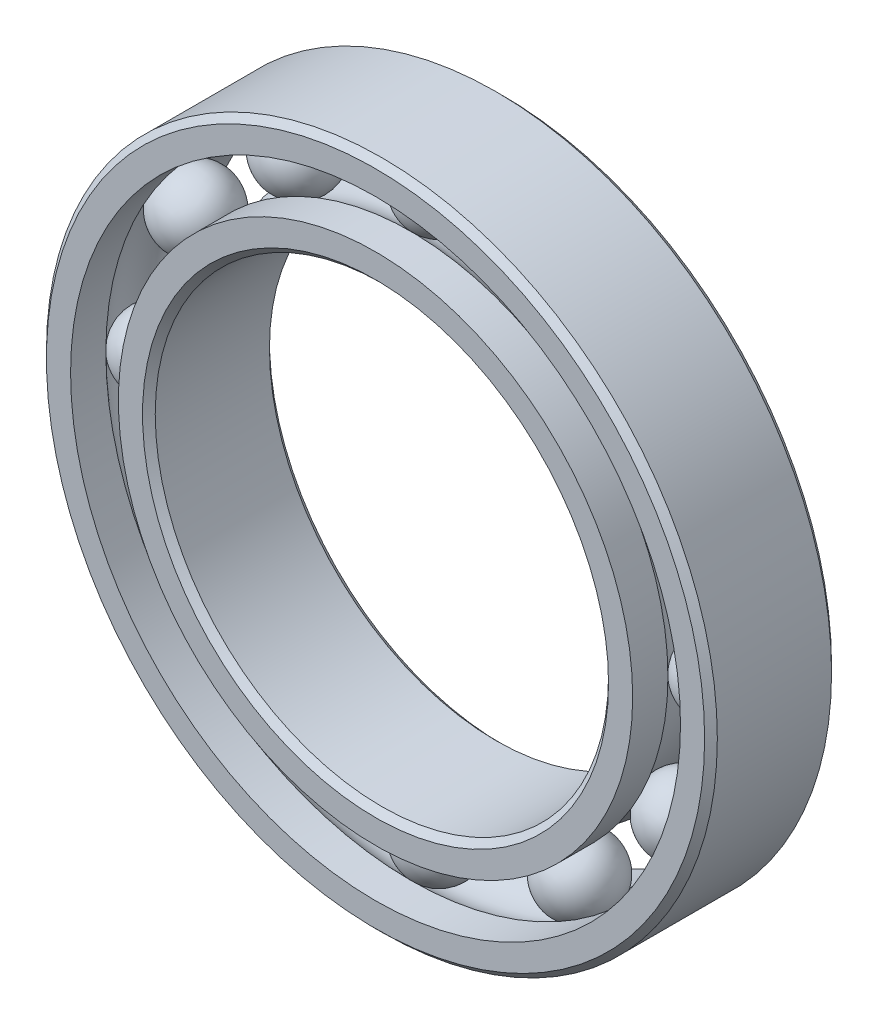
ISO-10303-21;
HEADER;
FILE_DESCRIPTION(('STEP AP214'),'2;1');
FILE_NAME('part.step','',(''),(''),'','','');
FILE_SCHEMA(('AUTOMOTIVE_DESIGN { 1 0 10303 214 1 1 1 1 }'));
ENDSEC;
DATA;
#1=APPLICATION_CONTEXT('core data for automotive mechanical design processes');
#2=APPLICATION_PROTOCOL_DEFINITION('international standard','automotive_design',2000,#1);
#3=PRODUCT_CONTEXT('',#1,'mechanical');
#4=PRODUCT('Part','Part','',(#3));
#5=PRODUCT_RELATED_PRODUCT_CATEGORY('part','',(#4));
#6=PRODUCT_DEFINITION_FORMATION('','',#4);
#7=PRODUCT_DEFINITION_CONTEXT('part definition',#1,'design');
#8=PRODUCT_DEFINITION('design','',#6,#7);
#9=PRODUCT_DEFINITION_SHAPE('','',#8);
#10=(LENGTH_UNIT() NAMED_UNIT(*) SI_UNIT(.MILLI.,.METRE.));
#11=(NAMED_UNIT(*) PLANE_ANGLE_UNIT() SI_UNIT($,.RADIAN.));
#12=(NAMED_UNIT(*) SI_UNIT($,.STERADIAN.) SOLID_ANGLE_UNIT());
#13=UNCERTAINTY_MEASURE_WITH_UNIT(LENGTH_MEASURE(1.E-05),#10,'distance_accuracy_value','');
#14=(GEOMETRIC_REPRESENTATION_CONTEXT(3) GLOBAL_UNCERTAINTY_ASSIGNED_CONTEXT((#13)) GLOBAL_UNIT_ASSIGNED_CONTEXT((#10,
#11,#12)) REPRESENTATION_CONTEXT('',''));
#15=CARTESIAN_POINT('',(0.,0.,0.));
#16=DIRECTION('',(0.,0.,1.));
#17=DIRECTION('',(1.,0.,0.));
#18=AXIS2_PLACEMENT_3D('',#15,#16,#17);
#19=CARTESIAN_POINT('',(0.,15.5,0.));
#20=DIRECTION('',(0.,0.,1.));
#21=DIRECTION('',(0.,1.,0.));
#22=AXIS2_PLACEMENT_3D('',#19,#20,#21);
#23=SPHERICAL_SURFACE('',#22,2.0392825960761);
#24=CARTESIAN_POINT('',(0.,15.5,2.03928259607609));
#25=VERTEX_POINT('',#24);
#26=VERTEX_LOOP('',#25);
#27=FACE_BOUND('',#26,.T.);
#28=ADVANCED_FACE('P0_F12',(#27),#23,.T.);
#29=CLOSED_SHELL('',(#28));
#30=MANIFOLD_SOLID_BREP('P0_B1',#29);
#31=CARTESIAN_POINT('',(0.,14.1813186813187,3.5));
#32=DIRECTION('',(0.,0.,-1.));
#33=DIRECTION('',(-1.,0.,0.));
#34=AXIS2_PLACEMENT_3D('',#31,#32,#33);
#35=PLANE('',#34);
#36=CARTESIAN_POINT('',(0.,0.,3.5));
#37=DIRECTION('',(0.,0.,1.));
#38=DIRECTION('',(1.,0.,0.));
#39=AXIS2_PLACEMENT_3D('',#36,#37,#38);
#40=CIRCLE('',#39,12.85);
#41=CARTESIAN_POINT('',(12.85,0.,3.5));
#42=VERTEX_POINT('',#41);
#43=EDGE_CURVE('P1_E69',#42,#42,#40,.T.);
#44=ORIENTED_EDGE('',*,*,#43,.F.);
#45=EDGE_LOOP('',(#44));
#46=FACE_BOUND('',#45,.T.);
#47=CARTESIAN_POINT('',(0.,0.,3.5));
#48=DIRECTION('',(0.,0.,1.));
#49=DIRECTION('',(1.,0.,0.));
#50=AXIS2_PLACEMENT_3D('',#47,#48,#49);
#51=CIRCLE('',#50,14.1813186813187);
#52=CARTESIAN_POINT('',(14.1813186813187,0.,3.5));
#53=VERTEX_POINT('',#52);
#54=EDGE_CURVE('P1_E11',#53,#53,#51,.T.);
#55=ORIENTED_EDGE('',*,*,#54,.T.);
#56=EDGE_LOOP('',(#55));
#57=FACE_BOUND('',#56,.T.);
#58=ADVANCED_FACE('P1_F17',(#46,#57),#35,.F.);
#59=CARTESIAN_POINT('',(0.,0.,3.5));
#60=DIRECTION('',(0.,0.,1.));
#61=DIRECTION('',(1.,0.,0.));
#62=AXIS2_PLACEMENT_3D('',#59,#60,#61);
#63=CYLINDRICAL_SURFACE('',#62,14.1813186813187);
#64=ORIENTED_EDGE('',*,*,#54,.F.);
#65=EDGE_LOOP('',(#64));
#66=FACE_BOUND('',#65,.T.);
#67=CARTESIAN_POINT('',(0.,0.,1.55555555555556));
#68=DIRECTION('',(0.,0.,1.));
#69=DIRECTION('',(1.,0.,0.));
#70=AXIS2_PLACEMENT_3D('',#67,#68,#69);
#71=CIRCLE('',#70,14.1813186813187);
#72=CARTESIAN_POINT('',(14.1813186813187,0.,1.55555555555556));
#73=VERTEX_POINT('',#72);
#74=EDGE_CURVE('P1_E24',#73,#73,#71,.T.);
#75=ORIENTED_EDGE('',*,*,#74,.T.);
#76=EDGE_LOOP('',(#75));
#77=FACE_BOUND('',#76,.T.);
#78=ADVANCED_FACE('P1_F84',(#66,#77),#63,.T.);
#79=CARTESIAN_POINT('',(0.,0.,0.));
#80=DIRECTION('',(0.,0.,1.));
#81=DIRECTION('',(1.,0.,0.));
#82=AXIS2_PLACEMENT_3D('',#79,#80,#81);
#83=TOROIDAL_SURFACE('',#82,15.5,2.03928259607609);
#84=ORIENTED_EDGE('',*,*,#74,.F.);
#85=EDGE_LOOP('',(#84));
#86=FACE_BOUND('',#85,.T.);
#87=CARTESIAN_POINT('',(0.,0.,-1.55555555555556));
#88=DIRECTION('',(0.,0.,1.));
#89=DIRECTION('',(1.,0.,0.));
#90=AXIS2_PLACEMENT_3D('',#87,#88,#89);
#91=CIRCLE('',#90,14.1813186813187);
#92=CARTESIAN_POINT('',(14.1813186813187,0.,-1.55555555555556));
#93=VERTEX_POINT('',#92);
#94=EDGE_CURVE('P1_E28',#93,#93,#91,.T.);
#95=ORIENTED_EDGE('',*,*,#94,.T.);
#96=EDGE_LOOP('',(#95));
#97=FACE_BOUND('',#96,.T.);
#98=ADVANCED_FACE('P1_F90',(#86,#97),#83,.F.);
#99=CARTESIAN_POINT('',(0.,0.,3.5));
#100=DIRECTION('',(0.,0.,1.));
#101=DIRECTION('',(1.,0.,0.));
#102=AXIS2_PLACEMENT_3D('',#99,#100,#101);
#103=CYLINDRICAL_SURFACE('',#102,14.1813186813187);
#104=ORIENTED_EDGE('',*,*,#94,.F.);
#105=EDGE_LOOP('',(#104));
#106=FACE_BOUND('',#105,.T.);
#107=CARTESIAN_POINT('',(0.,0.,-3.5));
#108=DIRECTION('',(0.,0.,1.));
#109=DIRECTION('',(1.,0.,0.));
#110=AXIS2_PLACEMENT_3D('',#107,#108,#109);
#111=CIRCLE('',#110,14.1813186813187);
#112=CARTESIAN_POINT('',(14.1813186813187,0.,-3.5));
#113=VERTEX_POINT('',#112);
#114=EDGE_CURVE('P1_E32',#113,#113,#111,.T.);
#115=ORIENTED_EDGE('',*,*,#114,.T.);
#116=EDGE_LOOP('',(#115));
#117=FACE_BOUND('',#116,.T.);
#118=ADVANCED_FACE('P1_F51',(#106,#117),#103,.T.);
#119=CARTESIAN_POINT('',(0.,12.85,-3.5));
#120=DIRECTION('',(0.,0.,1.));
#121=DIRECTION('',(1.,0.,0.));
#122=AXIS2_PLACEMENT_3D('',#119,#120,#121);
#123=PLANE('',#122);
#124=ORIENTED_EDGE('',*,*,#114,.F.);
#125=EDGE_LOOP('',(#124));
#126=FACE_BOUND('',#125,.T.);
#127=CARTESIAN_POINT('',(0.,0.,-3.5));
#128=DIRECTION('',(0.,0.,1.));
#129=DIRECTION('',(1.,0.,0.));
#130=AXIS2_PLACEMENT_3D('',#127,#128,#129);
#131=CIRCLE('',#130,12.85);
#132=CARTESIAN_POINT('',(12.85,0.,-3.5));
#133=VERTEX_POINT('',#132);
#134=EDGE_CURVE('P1_E40',#133,#133,#131,.T.);
#135=ORIENTED_EDGE('',*,*,#134,.T.);
#136=EDGE_LOOP('',(#135));
#137=FACE_BOUND('',#136,.T.);
#138=ADVANCED_FACE('P1_F53',(#126,#137),#123,.F.);
#139=CARTESIAN_POINT('',(0.,0.,-3.15));
#140=DIRECTION('',(0.,0.,-1.));
#141=DIRECTION('',(-1.,0.,0.));
#142=AXIS2_PLACEMENT_3D('',#139,#140,#141);
#143=CONICAL_SURFACE('',#142,12.5,0.78539816339745);
#144=ORIENTED_EDGE('',*,*,#134,.F.);
#145=EDGE_LOOP('',(#144));
#146=FACE_BOUND('',#145,.T.);
#147=CARTESIAN_POINT('',(0.,0.,-3.15));
#148=DIRECTION('',(0.,0.,1.));
#149=DIRECTION('',(1.,0.,0.));
#150=AXIS2_PLACEMENT_3D('',#147,#148,#149);
#151=CIRCLE('',#150,12.5);
#152=CARTESIAN_POINT('',(12.5,0.,-3.15));
#153=VERTEX_POINT('',#152);
#154=EDGE_CURVE('P1_E44',#153,#153,#151,.T.);
#155=ORIENTED_EDGE('',*,*,#154,.T.);
#156=EDGE_LOOP('',(#155));
#157=FACE_BOUND('',#156,.T.);
#158=ADVANCED_FACE('P1_F56',(#146,#157),#143,.F.);
#159=CARTESIAN_POINT('',(0.,0.,3.5));
#160=DIRECTION('',(0.,0.,1.));
#161=DIRECTION('',(1.,0.,0.));
#162=AXIS2_PLACEMENT_3D('',#159,#160,#161);
#163=CYLINDRICAL_SURFACE('',#162,12.5);
#164=ORIENTED_EDGE('',*,*,#154,.F.);
#165=EDGE_LOOP('',(#164));
#166=FACE_BOUND('',#165,.T.);
#167=CARTESIAN_POINT('',(0.,0.,3.15));
#168=DIRECTION('',(0.,0.,1.));
#169=DIRECTION('',(1.,0.,0.));
#170=AXIS2_PLACEMENT_3D('',#167,#168,#169);
#171=CIRCLE('',#170,12.5);
#172=CARTESIAN_POINT('',(12.5,0.,3.15));
#173=VERTEX_POINT('',#172);
#174=EDGE_CURVE('P1_E67',#173,#173,#171,.T.);
#175=ORIENTED_EDGE('',*,*,#174,.T.);
#176=EDGE_LOOP('',(#175));
#177=FACE_BOUND('',#176,.T.);
#178=ADVANCED_FACE('P1_F62',(#166,#177),#163,.F.);
#179=CARTESIAN_POINT('',(0.,0.,3.5));
#180=DIRECTION('',(0.,0.,1.));
#181=DIRECTION('',(1.,0.,0.));
#182=AXIS2_PLACEMENT_3D('',#179,#180,#181);
#183=CONICAL_SURFACE('',#182,12.85,0.785398163397446);
#184=ORIENTED_EDGE('',*,*,#174,.F.);
#185=EDGE_LOOP('',(#184));
#186=FACE_BOUND('',#185,.T.);
#187=ORIENTED_EDGE('',*,*,#43,.T.);
#188=EDGE_LOOP('',(#187));
#189=FACE_BOUND('',#188,.T.);
#190=ADVANCED_FACE('P1_F81',(#186,#189),#183,.F.);
#191=CLOSED_SHELL('',(#58,#78,#98,#118,#138,#158,#178,#190));
#192=MANIFOLD_SOLID_BREP('P1_B1',#191);
#193=CARTESIAN_POINT('',(0.,0.,3.15));
#194=DIRECTION('',(0.,0.,-1.));
#195=DIRECTION('',(-1.,0.,0.));
#196=AXIS2_PLACEMENT_3D('',#193,#194,#195);
#197=CONICAL_SURFACE('',#196,18.5,0.785398163397448);
#198=CARTESIAN_POINT('',(0.,0.,3.5));
#199=DIRECTION('',(0.,0.,1.));
#200=DIRECTION('',(1.,0.,0.));
#201=AXIS2_PLACEMENT_3D('',#198,#199,#200);
#202=CIRCLE('',#201,18.15);
#203=CARTESIAN_POINT('',(18.15,0.,3.5));
#204=VERTEX_POINT('',#203);
#205=EDGE_CURVE('P2_E45',#204,#204,#202,.T.);
#206=ORIENTED_EDGE('',*,*,#205,.F.);
#207=EDGE_LOOP('',(#206));
#208=FACE_BOUND('',#207,.T.);
#209=CARTESIAN_POINT('',(0.,0.,3.15));
#210=DIRECTION('',(0.,0.,1.));
#211=DIRECTION('',(1.,0.,0.));
#212=AXIS2_PLACEMENT_3D('',#209,#210,#211);
#213=CIRCLE('',#212,18.5);
#214=CARTESIAN_POINT('',(18.5,0.,3.15));
#215=VERTEX_POINT('',#214);
#216=EDGE_CURVE('P2_E11',#215,#215,#213,.T.);
#217=ORIENTED_EDGE('',*,*,#216,.T.);
#218=EDGE_LOOP('',(#217));
#219=FACE_BOUND('',#218,.T.);
#220=ADVANCED_FACE('P2_F17',(#208,#219),#197,.T.);
#221=CARTESIAN_POINT('',(0.,0.,3.5));
#222=DIRECTION('',(0.,0.,1.));
#223=DIRECTION('',(1.,0.,0.));
#224=AXIS2_PLACEMENT_3D('',#221,#222,#223);
#225=CYLINDRICAL_SURFACE('',#224,18.5);
#226=ORIENTED_EDGE('',*,*,#216,.F.);
#227=EDGE_LOOP('',(#226));
#228=FACE_BOUND('',#227,.T.);
#229=CARTESIAN_POINT('',(0.,0.,-3.15));
#230=DIRECTION('',(0.,0.,1.));
#231=DIRECTION('',(1.,0.,0.));
#232=AXIS2_PLACEMENT_3D('',#229,#230,#231);
#233=CIRCLE('',#232,18.5);
#234=CARTESIAN_POINT('',(18.5,0.,-3.15));
#235=VERTEX_POINT('',#234);
#236=EDGE_CURVE('P2_E23',#235,#235,#233,.T.);
#237=ORIENTED_EDGE('',*,*,#236,.T.);
#238=EDGE_LOOP('',(#237));
#239=FACE_BOUND('',#238,.T.);
#240=ADVANCED_FACE('P2_F83',(#228,#239),#225,.T.);
#241=CARTESIAN_POINT('',(0.,0.,-3.5));
#242=DIRECTION('',(0.,0.,1.));
#243=DIRECTION('',(1.,0.,0.));
#244=AXIS2_PLACEMENT_3D('',#241,#242,#243);
#245=CONICAL_SURFACE('',#244,18.15,0.785398163397448);
#246=ORIENTED_EDGE('',*,*,#236,.F.);
#247=EDGE_LOOP('',(#246));
#248=FACE_BOUND('',#247,.T.);
#249=CARTESIAN_POINT('',(0.,0.,-3.5));
#250=DIRECTION('',(0.,0.,1.));
#251=DIRECTION('',(1.,0.,0.));
#252=AXIS2_PLACEMENT_3D('',#249,#250,#251);
#253=CIRCLE('',#252,18.15);
#254=CARTESIAN_POINT('',(18.15,0.,-3.5));
#255=VERTEX_POINT('',#254);
#256=EDGE_CURVE('P2_E27',#255,#255,#253,.T.);
#257=ORIENTED_EDGE('',*,*,#256,.T.);
#258=EDGE_LOOP('',(#257));
#259=FACE_BOUND('',#258,.T.);
#260=ADVANCED_FACE('P2_F79',(#248,#259),#245,.T.);
#261=CARTESIAN_POINT('',(0.,18.15,-3.5));
#262=DIRECTION('',(0.,0.,1.));
#263=DIRECTION('',(1.,0.,0.));
#264=AXIS2_PLACEMENT_3D('',#261,#262,#263);
#265=PLANE('',#264);
#266=ORIENTED_EDGE('',*,*,#256,.F.);
#267=EDGE_LOOP('',(#266));
#268=FACE_BOUND('',#267,.T.);
#269=CARTESIAN_POINT('',(0.,0.,-3.5));
#270=DIRECTION('',(0.,0.,1.));
#271=DIRECTION('',(1.,0.,0.));
#272=AXIS2_PLACEMENT_3D('',#269,#270,#271);
#273=CIRCLE('',#272,16.8186813186813);
#274=CARTESIAN_POINT('',(16.8186813186813,0.,-3.5));
#275=VERTEX_POINT('',#274);
#276=EDGE_CURVE('P2_E31',#275,#275,#273,.T.);
#277=ORIENTED_EDGE('',*,*,#276,.T.);
#278=EDGE_LOOP('',(#277));
#279=FACE_BOUND('',#278,.T.);
#280=ADVANCED_FACE('P2_F64',(#268,#279),#265,.F.);
#281=CARTESIAN_POINT('',(0.,0.,3.5));
#282=DIRECTION('',(0.,0.,1.));
#283=DIRECTION('',(1.,0.,0.));
#284=AXIS2_PLACEMENT_3D('',#281,#282,#283);
#285=CYLINDRICAL_SURFACE('',#284,16.8186813186813);
#286=ORIENTED_EDGE('',*,*,#276,.F.);
#287=EDGE_LOOP('',(#286));
#288=FACE_BOUND('',#287,.T.);
#289=CARTESIAN_POINT('',(0.,0.,-1.55555555555556));
#290=DIRECTION('',(0.,0.,1.));
#291=DIRECTION('',(1.,0.,0.));
#292=AXIS2_PLACEMENT_3D('',#289,#290,#291);
#293=CIRCLE('',#292,16.8186813186813);
#294=CARTESIAN_POINT('',(16.8186813186813,0.,-1.55555555555556));
#295=VERTEX_POINT('',#294);
#296=EDGE_CURVE('P2_E55',#295,#295,#293,.T.);
#297=ORIENTED_EDGE('',*,*,#296,.T.);
#298=EDGE_LOOP('',(#297));
#299=FACE_BOUND('',#298,.T.);
#300=ADVANCED_FACE('P2_F66',(#288,#299),#285,.F.);
#301=CARTESIAN_POINT('',(0.,0.,0.));
#302=DIRECTION('',(0.,0.,1.));
#303=DIRECTION('',(1.,0.,0.));
#304=AXIS2_PLACEMENT_3D('',#301,#302,#303);
#305=TOROIDAL_SURFACE('',#304,15.5,2.0392825960761);
#306=ORIENTED_EDGE('',*,*,#296,.F.);
#307=EDGE_LOOP('',(#306));
#308=FACE_BOUND('',#307,.T.);
#309=CARTESIAN_POINT('',(0.,0.,1.55555555555556));
#310=DIRECTION('',(0.,0.,1.));
#311=DIRECTION('',(1.,0.,0.));
#312=AXIS2_PLACEMENT_3D('',#309,#310,#311);
#313=CIRCLE('',#312,16.8186813186813);
#314=CARTESIAN_POINT('',(16.8186813186813,0.,1.55555555555556));
#315=VERTEX_POINT('',#314);
#316=EDGE_CURVE('P2_E52',#315,#315,#313,.T.);
#317=ORIENTED_EDGE('',*,*,#316,.T.);
#318=EDGE_LOOP('',(#317));
#319=FACE_BOUND('',#318,.T.);
#320=ADVANCED_FACE('P2_F68',(#308,#319),#305,.F.);
#321=CARTESIAN_POINT('',(0.,0.,3.5));
#322=DIRECTION('',(0.,0.,1.));
#323=DIRECTION('',(1.,0.,0.));
#324=AXIS2_PLACEMENT_3D('',#321,#322,#323);
#325=CYLINDRICAL_SURFACE('',#324,16.8186813186813);
#326=ORIENTED_EDGE('',*,*,#316,.F.);
#327=EDGE_LOOP('',(#326));
#328=FACE_BOUND('',#327,.T.);
#329=CARTESIAN_POINT('',(0.,0.,3.5));
#330=DIRECTION('',(0.,0.,1.));
#331=DIRECTION('',(1.,0.,0.));
#332=AXIS2_PLACEMENT_3D('',#329,#330,#331);
#333=CIRCLE('',#332,16.8186813186813);
#334=CARTESIAN_POINT('',(16.8186813186813,0.,3.5));
#335=VERTEX_POINT('',#334);
#336=EDGE_CURVE('P2_E48',#335,#335,#333,.T.);
#337=ORIENTED_EDGE('',*,*,#336,.T.);
#338=EDGE_LOOP('',(#337));
#339=FACE_BOUND('',#338,.T.);
#340=ADVANCED_FACE('P2_F76',(#328,#339),#325,.F.);
#341=CARTESIAN_POINT('',(0.,18.15,3.5));
#342=DIRECTION('',(0.,0.,-1.));
#343=DIRECTION('',(-1.,0.,0.));
#344=AXIS2_PLACEMENT_3D('',#341,#342,#343);
#345=PLANE('',#344);
#346=ORIENTED_EDGE('',*,*,#336,.F.);
#347=EDGE_LOOP('',(#346));
#348=FACE_BOUND('',#347,.T.);
#349=ORIENTED_EDGE('',*,*,#205,.T.);
#350=EDGE_LOOP('',(#349));
#351=FACE_BOUND('',#350,.T.);
#352=ADVANCED_FACE('P2_F92',(#348,#351),#345,.F.);
#353=CLOSED_SHELL('',(#220,#240,#260,#280,#300,#320,#340,#352));
#354=MANIFOLD_SOLID_BREP('P2_B1',#353);
#355=CARTESIAN_POINT('',(-7.74999999999983,13.4233937586589,0.));
#356=DIRECTION('',(0.,0.,1.));
#357=DIRECTION('',(-0.499999999999989,0.866025403784445,0.));
#358=AXIS2_PLACEMENT_3D('',#355,#356,#357);
#359=SPHERICAL_SURFACE('',#358,2.0392825960761);
#360=CARTESIAN_POINT('',(-7.74999999999983,13.4233937586589,2.03928259607609));
#361=VERTEX_POINT('',#360);
#362=VERTEX_LOOP('',#361);
#363=FACE_BOUND('',#362,.T.);
#364=ADVANCED_FACE('P3_F12',(#363),#359,.T.);
#365=CLOSED_SHELL('',(#364));
#366=MANIFOLD_SOLID_BREP('P3_B1',#365);
#367=CARTESIAN_POINT('',(-13.4233937586587,7.75000000000016,0.));
#368=DIRECTION('',(0.,0.,1.));
#369=DIRECTION('',(-0.866025403784433,0.50000000000001,0.));
#370=AXIS2_PLACEMENT_3D('',#367,#368,#369);
#371=SPHERICAL_SURFACE('',#370,2.0392825960761);
#372=CARTESIAN_POINT('',(-13.4233937586587,7.75000000000016,2.03928259607609));
#373=VERTEX_POINT('',#372);
#374=VERTEX_LOOP('',#373);
#375=FACE_BOUND('',#374,.T.);
#376=ADVANCED_FACE('P4_F12',(#375),#371,.T.);
#377=CLOSED_SHELL('',(#376));
#378=MANIFOLD_SOLID_BREP('P4_B1',#377);
#379=CARTESIAN_POINT('',(-15.5,1.62353882256205E-13,0.));
#380=DIRECTION('',(0.,0.,1.));
#381=DIRECTION('',(-1.,0.,0.));
#382=AXIS2_PLACEMENT_3D('',#379,#380,#381);
#383=SPHERICAL_SURFACE('',#382,2.0392825960761);
#384=CARTESIAN_POINT('',(-15.5,1.62353882256205E-13,2.03928259607609));
#385=VERTEX_POINT('',#384);
#386=VERTEX_LOOP('',#385);
#387=FACE_BOUND('',#386,.T.);
#388=ADVANCED_FACE('P5_F12',(#387),#383,.T.);
#389=CLOSED_SHELL('',(#388));
#390=MANIFOLD_SOLID_BREP('P5_B1',#389);
#391=CARTESIAN_POINT('',(-13.4233937586589,-7.74999999999988,0.));
#392=DIRECTION('',(0.,0.,1.));
#393=DIRECTION('',(-0.866025403784443,-0.499999999999992,0.));
#394=AXIS2_PLACEMENT_3D('',#391,#392,#393);
#395=SPHERICAL_SURFACE('',#394,2.0392825960761);
#396=CARTESIAN_POINT('',(-13.4233937586589,-7.74999999999988,2.03928259607609));
#397=VERTEX_POINT('',#396);
#398=VERTEX_LOOP('',#397);
#399=FACE_BOUND('',#398,.T.);
#400=ADVANCED_FACE('P6_F12',(#399),#395,.T.);
#401=CLOSED_SHELL('',(#400));
#402=MANIFOLD_SOLID_BREP('P6_B1',#401);
#403=CARTESIAN_POINT('',(-7.75000000000011,-13.4233937586587,0.));
#404=DIRECTION('',(0.,0.,1.));
#405=DIRECTION('',(-0.500000000000007,-0.866025403784435,0.));
#406=AXIS2_PLACEMENT_3D('',#403,#404,#405);
#407=SPHERICAL_SURFACE('',#406,2.0392825960761);
#408=CARTESIAN_POINT('',(-7.75000000000011,-13.4233937586587,2.03928259607609));
#409=VERTEX_POINT('',#408);
#410=VERTEX_LOOP('',#409);
#411=FACE_BOUND('',#410,.T.);
#412=ADVANCED_FACE('P7_F12',(#411),#407,.T.);
#413=CLOSED_SHELL('',(#412));
#414=MANIFOLD_SOLID_BREP('P7_B1',#413);
#415=CARTESIAN_POINT('',(-1.08235921504137E-13,-15.5,0.));
#416=DIRECTION('',(0.,0.,1.));
#417=DIRECTION('',(0.,-1.,0.));
#418=AXIS2_PLACEMENT_3D('',#415,#416,#417);
#419=SPHERICAL_SURFACE('',#418,2.0392825960761);
#420=CARTESIAN_POINT('',(-1.08235921504137E-13,-15.5,2.03928259607609));
#421=VERTEX_POINT('',#420);
#422=VERTEX_LOOP('',#421);
#423=FACE_BOUND('',#422,.T.);
#424=ADVANCED_FACE('P8_F12',(#423),#419,.T.);
#425=CLOSED_SHELL('',(#424));
#426=MANIFOLD_SOLID_BREP('P8_B1',#425);
#427=CARTESIAN_POINT('',(7.75,-13.4233937586588,0.));
#428=DIRECTION('',(0.,0.,1.));
#429=DIRECTION('',(0.5,-0.866025403784442,0.));
#430=AXIS2_PLACEMENT_3D('',#427,#428,#429);
#431=SPHERICAL_SURFACE('',#430,2.0392825960761);
#432=CARTESIAN_POINT('',(7.75,-13.4233937586588,2.03928259607609));
#433=VERTEX_POINT('',#432);
#434=VERTEX_LOOP('',#433);
#435=FACE_BOUND('',#434,.T.);
#436=ADVANCED_FACE('P9_F12',(#435),#431,.T.);
#437=CLOSED_SHELL('',(#436));
#438=MANIFOLD_SOLID_BREP('P9_B1',#437);
#439=CARTESIAN_POINT('',(13.4233937586588,-7.75,0.));
#440=DIRECTION('',(0.,0.,1.));
#441=DIRECTION('',(0.866025403784437,-0.5,0.));
#442=AXIS2_PLACEMENT_3D('',#439,#440,#441);
#443=SPHERICAL_SURFACE('',#442,2.0392825960761);
#444=CARTESIAN_POINT('',(13.4233937586588,-7.75,2.03928259607609));
#445=VERTEX_POINT('',#444);
#446=VERTEX_LOOP('',#445);
#447=FACE_BOUND('',#446,.T.);
#448=ADVANCED_FACE('P10_F12',(#447),#443,.T.);
#449=CLOSED_SHELL('',(#448));
#450=MANIFOLD_SOLID_BREP('P10_B1',#449);
#451=CARTESIAN_POINT('',(15.5,0.,0.));
#452=DIRECTION('',(0.,0.,1.));
#453=DIRECTION('',(1.,0.,0.));
#454=AXIS2_PLACEMENT_3D('',#451,#452,#453);
#455=SPHERICAL_SURFACE('',#454,2.0392825960761);
#456=CARTESIAN_POINT('',(15.5,0.,2.03928259607609));
#457=VERTEX_POINT('',#456);
#458=VERTEX_LOOP('',#457);
#459=FACE_BOUND('',#458,.T.);
#460=ADVANCED_FACE('P11_F12',(#459),#455,.T.);
#461=CLOSED_SHELL('',(#460));
#462=MANIFOLD_SOLID_BREP('P11_B1',#461);
#463=CARTESIAN_POINT('',(13.4233937586588,7.75,0.));
#464=DIRECTION('',(0.,0.,1.));
#465=DIRECTION('',(0.86602540378444,0.5,0.));
#466=AXIS2_PLACEMENT_3D('',#463,#464,#465);
#467=SPHERICAL_SURFACE('',#466,2.0392825960761);
#468=CARTESIAN_POINT('',(13.4233937586588,7.75,2.03928259607609));
#469=VERTEX_POINT('',#468);
#470=VERTEX_LOOP('',#469);
#471=FACE_BOUND('',#470,.T.);
#472=ADVANCED_FACE('P12_F12',(#471),#467,.T.);
#473=CLOSED_SHELL('',(#472));
#474=MANIFOLD_SOLID_BREP('P12_B1',#473);
#475=CARTESIAN_POINT('',(7.75,13.4233937586588,0.));
#476=DIRECTION('',(0.,0.,1.));
#477=DIRECTION('',(0.5,0.866025403784438,0.));
#478=AXIS2_PLACEMENT_3D('',#475,#476,#477);
#479=SPHERICAL_SURFACE('',#478,2.0392825960761);
#480=CARTESIAN_POINT('',(7.75,13.4233937586588,2.03928259607609));
#481=VERTEX_POINT('',#480);
#482=VERTEX_LOOP('',#481);
#483=FACE_BOUND('',#482,.T.);
#484=ADVANCED_FACE('P13_F12',(#483),#479,.T.);
#485=CLOSED_SHELL('',(#484));
#486=MANIFOLD_SOLID_BREP('P13_B1',#485);
#487=ADVANCED_BREP_SHAPE_REPRESENTATION('',(#18,#30,#192,#354,#366,#378,#390,#402,#414,#426,
#438,#450,#462,#474,#486),#14);
#488=SHAPE_DEFINITION_REPRESENTATION(#9,#487);
ENDSEC;
END-ISO-10303-21;
